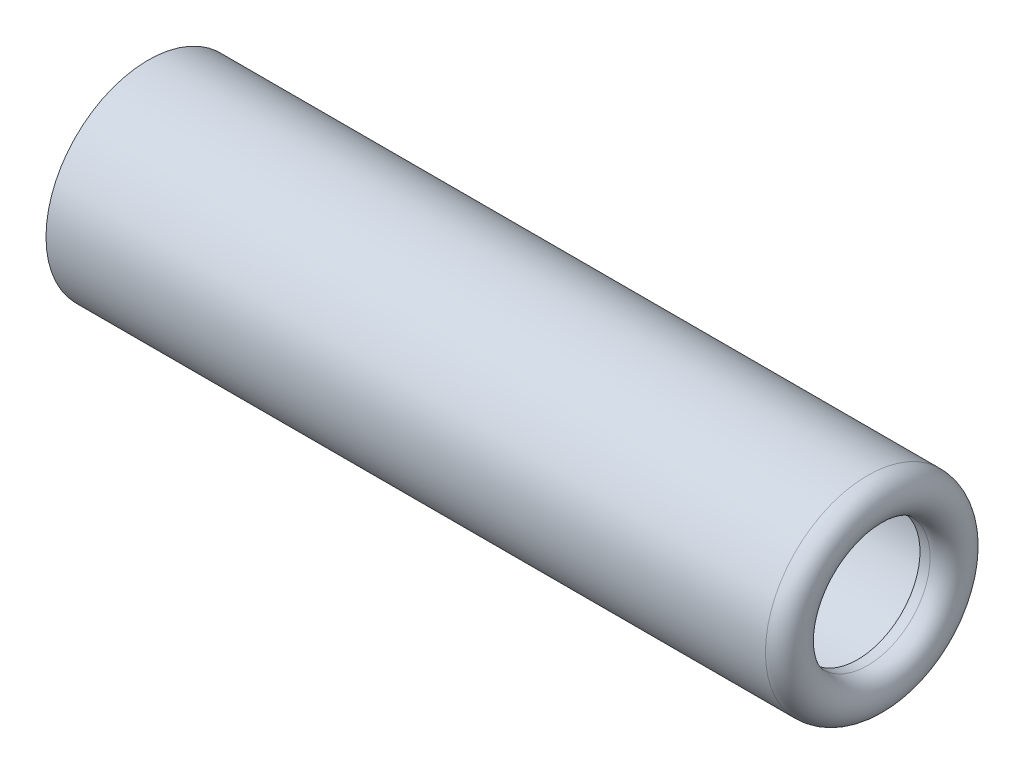
ISO-10303-21;
HEADER;
FILE_DESCRIPTION(('STEP AP214'),'2;1');
FILE_NAME('part.step','',(''),(''),'','','');
FILE_SCHEMA(('AUTOMOTIVE_DESIGN { 1 0 10303 214 1 1 1 1 }'));
ENDSEC;
DATA;
#1=APPLICATION_CONTEXT('core data for automotive mechanical design processes');
#2=APPLICATION_PROTOCOL_DEFINITION('international standard','automotive_design',2000,#1);
#3=PRODUCT_CONTEXT('',#1,'mechanical');
#4=PRODUCT('Part','Part','',(#3));
#5=PRODUCT_RELATED_PRODUCT_CATEGORY('part','',(#4));
#6=PRODUCT_DEFINITION_FORMATION('','',#4);
#7=PRODUCT_DEFINITION_CONTEXT('part definition',#1,'design');
#8=PRODUCT_DEFINITION('design','',#6,#7);
#9=PRODUCT_DEFINITION_SHAPE('','',#8);
#10=(LENGTH_UNIT() NAMED_UNIT(*) SI_UNIT(.MILLI.,.METRE.));
#11=(NAMED_UNIT(*) PLANE_ANGLE_UNIT() SI_UNIT($,.RADIAN.));
#12=(NAMED_UNIT(*) SI_UNIT($,.STERADIAN.) SOLID_ANGLE_UNIT());
#13=UNCERTAINTY_MEASURE_WITH_UNIT(LENGTH_MEASURE(1.E-05),#10,'distance_accuracy_value','');
#14=(GEOMETRIC_REPRESENTATION_CONTEXT(3) GLOBAL_UNCERTAINTY_ASSIGNED_CONTEXT((#13)) GLOBAL_UNIT_ASSIGNED_CONTEXT((#10,
#11,#12)) REPRESENTATION_CONTEXT('',''));
#15=CARTESIAN_POINT('',(0.,0.,0.));
#16=DIRECTION('',(0.,0.,1.));
#17=DIRECTION('',(1.,0.,0.));
#18=AXIS2_PLACEMENT_3D('',#15,#16,#17);
#19=CARTESIAN_POINT('',(39.7603578881712,1.1154549506287E-11,1.58220008275589E-12));
#20=DIRECTION('',(-1.,-4.45724184725178E-13,0.));
#21=DIRECTION('',(0.,0.,1.));
#22=AXIS2_PLACEMENT_3D('',#19,#20,#21);
#23=TOROIDAL_SURFACE('',#22,1.60655000000562,0.387349999998128);
#24=CARTESIAN_POINT('',(39.76035788817,0.,0.));
#25=DIRECTION('',(-1.,0.,0.));
#26=DIRECTION('',(0.,0.,-1.));
#27=AXIS2_PLACEMENT_3D('',#24,#25,#26);
#28=CIRCLE('',#27,1.2192);
#29=CARTESIAN_POINT('',(39.76035788817,0.,-1.2192));
#30=VERTEX_POINT('',#29);
#31=EDGE_CURVE('E23',#30,#30,#28,.T.);
#32=ORIENTED_EDGE('',*,*,#31,.T.);
#33=EDGE_LOOP('',(#32));
#34=FACE_BOUND('',#33,.T.);
#35=CARTESIAN_POINT('',(39.76035788817,0.,0.));
#36=DIRECTION('',(1.,0.,0.));
#37=DIRECTION('',(0.,0.,1.));
#38=AXIS2_PLACEMENT_3D('',#35,#36,#37);
#39=CIRCLE('',#38,1.9939);
#40=CARTESIAN_POINT('',(39.76035788817,0.,1.9939));
#41=VERTEX_POINT('',#40);
#42=EDGE_CURVE('E10',#41,#41,#39,.T.);
#43=ORIENTED_EDGE('',*,*,#42,.T.);
#44=EDGE_LOOP('',(#43));
#45=FACE_BOUND('',#44,.T.);
#46=ADVANCED_FACE('F15',(#34,#45),#23,.T.);
#47=CARTESIAN_POINT('',(0.,0.,0.));
#48=DIRECTION('',(-1.,0.,0.));
#49=DIRECTION('',(0.,0.,1.));
#50=AXIS2_PLACEMENT_3D('',#47,#48,#49);
#51=CYLINDRICAL_SURFACE('',#50,1.9939);
#52=ORIENTED_EDGE('',*,*,#42,.F.);
#53=EDGE_LOOP('',(#52));
#54=FACE_BOUND('',#53,.T.);
#55=CARTESIAN_POINT('',(25.72050788817,0.,0.));
#56=DIRECTION('',(-1.,0.,0.));
#57=DIRECTION('',(0.,0.,1.));
#58=AXIS2_PLACEMENT_3D('',#55,#56,#57);
#59=CIRCLE('',#58,1.9939);
#60=CARTESIAN_POINT('',(25.72050788817,0.,1.9939));
#61=VERTEX_POINT('',#60);
#62=EDGE_CURVE('E31',#61,#61,#59,.T.);
#63=ORIENTED_EDGE('',*,*,#62,.F.);
#64=EDGE_LOOP('',(#63));
#65=FACE_BOUND('',#64,.T.);
#66=ADVANCED_FACE('F77',(#54,#65),#51,.T.);
#67=CARTESIAN_POINT('',(0.,0.,0.));
#68=DIRECTION('',(-1.,0.,0.));
#69=DIRECTION('',(0.,0.,1.));
#70=AXIS2_PLACEMENT_3D('',#67,#68,#69);
#71=CYLINDRICAL_SURFACE('',#70,1.2192);
#72=CARTESIAN_POINT('',(39.56350788817,0.,0.));
#73=DIRECTION('',(1.,0.,0.));
#74=DIRECTION('',(0.,0.,1.));
#75=AXIS2_PLACEMENT_3D('',#72,#73,#74);
#76=CIRCLE('',#75,1.2192);
#77=CARTESIAN_POINT('',(39.56350788817,0.,1.2192));
#78=VERTEX_POINT('',#77);
#79=EDGE_CURVE('E35',#78,#78,#76,.T.);
#80=ORIENTED_EDGE('',*,*,#79,.F.);
#81=EDGE_LOOP('',(#80));
#82=FACE_BOUND('',#81,.T.);
#83=ORIENTED_EDGE('',*,*,#31,.F.);
#84=EDGE_LOOP('',(#83));
#85=FACE_BOUND('',#84,.T.);
#86=ADVANCED_FACE('F71',(#82,#85),#71,.F.);
#87=CARTESIAN_POINT('',(39.56350788817,1.4732,0.));
#88=DIRECTION('',(1.,0.,0.));
#89=DIRECTION('',(0.,0.,-1.));
#90=AXIS2_PLACEMENT_3D('',#87,#88,#89);
#91=PLANE('',#90);
#92=CARTESIAN_POINT('',(39.56350788817,0.,0.));
#93=DIRECTION('',(-1.,0.,0.));
#94=DIRECTION('',(0.,0.,-1.));
#95=AXIS2_PLACEMENT_3D('',#92,#93,#94);
#96=CIRCLE('',#95,1.4732);
#97=CARTESIAN_POINT('',(39.56350788817,0.,-1.4732));
#98=VERTEX_POINT('',#97);
#99=EDGE_CURVE('E28',#98,#98,#96,.T.);
#100=ORIENTED_EDGE('',*,*,#99,.T.);
#101=EDGE_LOOP('',(#100));
#102=FACE_BOUND('',#101,.T.);
#103=ORIENTED_EDGE('',*,*,#79,.T.);
#104=EDGE_LOOP('',(#103));
#105=FACE_BOUND('',#104,.T.);
#106=ADVANCED_FACE('F65',(#102,#105),#91,.F.);
#107=CARTESIAN_POINT('',(0.,0.,0.));
#108=DIRECTION('',(-1.,0.,0.));
#109=DIRECTION('',(0.,0.,1.));
#110=AXIS2_PLACEMENT_3D('',#107,#108,#109);
#111=CYLINDRICAL_SURFACE('',#110,1.4732);
#112=CARTESIAN_POINT('',(39.76035788817,0.,0.));
#113=DIRECTION('',(1.,0.,0.));
#114=DIRECTION('',(0.,0.,1.));
#115=AXIS2_PLACEMENT_3D('',#112,#113,#114);
#116=CIRCLE('',#115,1.4732);
#117=CARTESIAN_POINT('',(39.76035788817,0.,1.4732));
#118=VERTEX_POINT('',#117);
#119=EDGE_CURVE('E38',#118,#118,#116,.T.);
#120=ORIENTED_EDGE('',*,*,#119,.F.);
#121=EDGE_LOOP('',(#120));
#122=FACE_BOUND('',#121,.T.);
#123=ORIENTED_EDGE('',*,*,#99,.F.);
#124=EDGE_LOOP('',(#123));
#125=FACE_BOUND('',#124,.T.);
#126=ADVANCED_FACE('F59',(#122,#125),#111,.T.);
#127=CARTESIAN_POINT('',(39.760357888168,-2.87972423684835E-11,-4.31601802908244E-12));
#128=DIRECTION('',(-1.,1.93108715601364E-12,-2.5542229066654E-13));
#129=DIRECTION('',(-2.5542229066654E-13,0.,1.));
#130=AXIS2_PLACEMENT_3D('',#127,#128,#129);
#131=TOROIDAL_SURFACE('',#130,1.60655000001391,0.133349999995429);
#132=CARTESIAN_POINT('',(39.76035788817,0.,0.));
#133=DIRECTION('',(-1.,0.,0.));
#134=DIRECTION('',(0.,0.,1.));
#135=AXIS2_PLACEMENT_3D('',#132,#133,#134);
#136=CIRCLE('',#135,1.7399);
#137=CARTESIAN_POINT('',(39.76035788817,0.,1.7399));
#138=VERTEX_POINT('',#137);
#139=EDGE_CURVE('E43',#138,#138,#136,.T.);
#140=ORIENTED_EDGE('',*,*,#139,.T.);
#141=EDGE_LOOP('',(#140));
#142=FACE_BOUND('',#141,.T.);
#143=ORIENTED_EDGE('',*,*,#119,.T.);
#144=EDGE_LOOP('',(#143));
#145=FACE_BOUND('',#144,.T.);
#146=ADVANCED_FACE('F53',(#142,#145),#131,.F.);
#147=CARTESIAN_POINT('',(0.,0.,0.));
#148=DIRECTION('',(-1.,0.,0.));
#149=DIRECTION('',(0.,0.,1.));
#150=AXIS2_PLACEMENT_3D('',#147,#148,#149);
#151=CYLINDRICAL_SURFACE('',#150,1.7399);
#152=CARTESIAN_POINT('',(25.84750788817,0.,0.));
#153=DIRECTION('',(1.,0.,0.));
#154=DIRECTION('',(0.,0.,1.));
#155=AXIS2_PLACEMENT_3D('',#152,#153,#154);
#156=CIRCLE('',#155,1.7399);
#157=CARTESIAN_POINT('',(25.84750788817,0.,1.7399));
#158=VERTEX_POINT('',#157);
#159=EDGE_CURVE('E34',#158,#158,#156,.T.);
#160=ORIENTED_EDGE('',*,*,#159,.F.);
#161=EDGE_LOOP('',(#160));
#162=FACE_BOUND('',#161,.T.);
#163=ORIENTED_EDGE('',*,*,#139,.F.);
#164=EDGE_LOOP('',(#163));
#165=FACE_BOUND('',#164,.T.);
#166=ADVANCED_FACE('F50',(#162,#165),#151,.F.);
#167=CARTESIAN_POINT('',(25.84750788817,0.,0.));
#168=DIRECTION('',(-1.,0.,0.));
#169=DIRECTION('',(0.,0.,-1.));
#170=AXIS2_PLACEMENT_3D('',#167,#168,#169);
#171=TOROIDAL_SURFACE('',#170,1.8669,0.127);
#172=CARTESIAN_POINT('',(25.72050788817,0.,0.));
#173=DIRECTION('',(1.,0.,0.));
#174=DIRECTION('',(0.,0.,1.));
#175=AXIS2_PLACEMENT_3D('',#172,#173,#174);
#176=CIRCLE('',#175,1.8669);
#177=CARTESIAN_POINT('',(25.72050788817,0.,1.8669));
#178=VERTEX_POINT('',#177);
#179=EDGE_CURVE('E19',#178,#178,#176,.T.);
#180=ORIENTED_EDGE('',*,*,#179,.F.);
#181=EDGE_LOOP('',(#180));
#182=FACE_BOUND('',#181,.T.);
#183=ORIENTED_EDGE('',*,*,#159,.T.);
#184=EDGE_LOOP('',(#183));
#185=FACE_BOUND('',#184,.T.);
#186=ADVANCED_FACE('F48',(#182,#185),#171,.T.);
#187=CARTESIAN_POINT('',(25.72050788817,1.8669,0.));
#188=DIRECTION('',(1.,0.,0.));
#189=DIRECTION('',(0.,0.,-1.));
#190=AXIS2_PLACEMENT_3D('',#187,#188,#189);
#191=PLANE('',#190);
#192=ORIENTED_EDGE('',*,*,#62,.T.);
#193=EDGE_LOOP('',(#192));
#194=FACE_BOUND('',#193,.T.);
#195=ORIENTED_EDGE('',*,*,#179,.T.);
#196=EDGE_LOOP('',(#195));
#197=FACE_BOUND('',#196,.T.);
#198=ADVANCED_FACE('F17',(#194,#197),#191,.F.);
#199=CLOSED_SHELL('',(#46,#66,#86,#106,#126,#146,#166,#186,#198));
#200=MANIFOLD_SOLID_BREP('B1',#199);
#201=ADVANCED_BREP_SHAPE_REPRESENTATION('',(#18,#200),#14);
#202=SHAPE_DEFINITION_REPRESENTATION(#9,#201);
ENDSEC;
END-ISO-10303-21;
